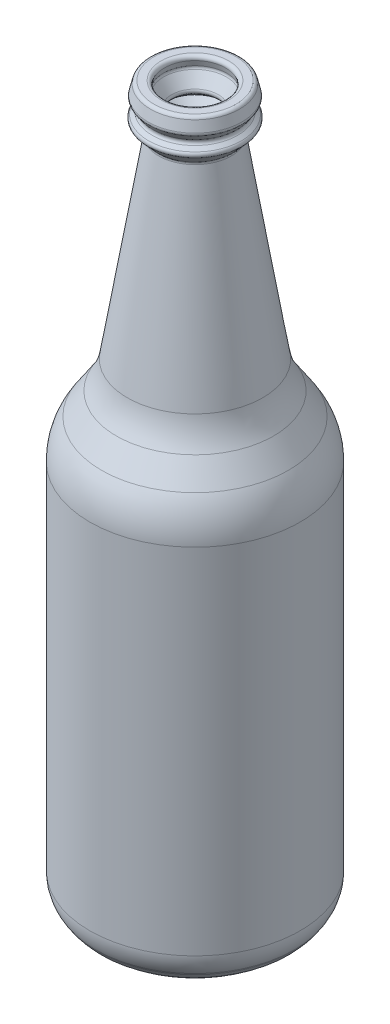
ISO-10303-21;
HEADER;
FILE_DESCRIPTION(('STEP AP214'),'2;1');
FILE_NAME('part.step','',(''),(''),'','','');
FILE_SCHEMA(('AUTOMOTIVE_DESIGN { 1 0 10303 214 1 1 1 1 }'));
ENDSEC;
DATA;
#1=APPLICATION_CONTEXT('core data for automotive mechanical design processes');
#2=APPLICATION_PROTOCOL_DEFINITION('international standard','automotive_design',2000,#1);
#3=PRODUCT_CONTEXT('',#1,'mechanical');
#4=PRODUCT('Part','Part','',(#3));
#5=PRODUCT_RELATED_PRODUCT_CATEGORY('part','',(#4));
#6=PRODUCT_DEFINITION_FORMATION('','',#4);
#7=PRODUCT_DEFINITION_CONTEXT('part definition',#1,'design');
#8=PRODUCT_DEFINITION('design','',#6,#7);
#9=PRODUCT_DEFINITION_SHAPE('','',#8);
#10=(LENGTH_UNIT() NAMED_UNIT(*) SI_UNIT(.MILLI.,.METRE.));
#11=(NAMED_UNIT(*) PLANE_ANGLE_UNIT() SI_UNIT($,.RADIAN.));
#12=(NAMED_UNIT(*) SI_UNIT($,.STERADIAN.) SOLID_ANGLE_UNIT());
#13=UNCERTAINTY_MEASURE_WITH_UNIT(LENGTH_MEASURE(1.E-05),#10,'distance_accuracy_value','');
#14=(GEOMETRIC_REPRESENTATION_CONTEXT(3) GLOBAL_UNCERTAINTY_ASSIGNED_CONTEXT((#13)) GLOBAL_UNIT_ASSIGNED_CONTEXT((#10,
#11,#12)) REPRESENTATION_CONTEXT('',''));
#15=CARTESIAN_POINT('',(0.,0.,0.));
#16=DIRECTION('',(0.,0.,1.));
#17=DIRECTION('',(1.,0.,0.));
#18=AXIS2_PLACEMENT_3D('',#15,#16,#17);
#19=CARTESIAN_POINT('',(0.,47.7867381624694,0.));
#20=DIRECTION('',(0.,-1.,0.));
#21=DIRECTION('',(0.,0.,-1.));
#22=AXIS2_PLACEMENT_3D('',#19,#20,#21);
#23=PLANE('',#22);
#24=CARTESIAN_POINT('',(0.,47.7867381624694,0.));
#25=DIRECTION('',(0.,-1.,0.));
#26=DIRECTION('',(0.,0.,-1.));
#27=AXIS2_PLACEMENT_3D('',#24,#25,#26);
#28=CIRCLE('',#27,9.65767078078676);
#29=CARTESIAN_POINT('',(0.,47.7867381624694,-9.65767078078676));
#30=VERTEX_POINT('',#29);
#31=EDGE_CURVE('E74',#30,#30,#28,.T.);
#32=ORIENTED_EDGE('',*,*,#31,.T.);
#33=EDGE_LOOP('',(#32));
#34=FACE_BOUND('',#33,.T.);
#35=CARTESIAN_POINT('',(0.,47.7867381624694,0.));
#36=DIRECTION('',(0.,-1.,0.));
#37=DIRECTION('',(0.,0.,-1.));
#38=AXIS2_PLACEMENT_3D('',#35,#36,#37);
#39=CIRCLE('',#38,11.7192235935956);
#40=CARTESIAN_POINT('',(0.,47.7867381624694,-11.7192235935956));
#41=VERTEX_POINT('',#40);
#42=EDGE_CURVE('E77',#41,#41,#39,.F.);
#43=ORIENTED_EDGE('',*,*,#42,.T.);
#44=EDGE_LOOP('',(#43));
#45=FACE_BOUND('',#44,.T.);
#46=ADVANCED_FACE('F39',(#34,#45),#23,.F.);
#47=CARTESIAN_POINT('',(0.,43.7867381624694,0.));
#48=DIRECTION('',(0.,-1.,0.));
#49=DIRECTION('',(0.,0.,-1.));
#50=AXIS2_PLACEMENT_3D('',#47,#48,#49);
#51=CONICAL_SURFACE('',#50,13.5,0.244978663126864);
#52=CARTESIAN_POINT('',(0.,47.0292737875058,0.));
#53=DIRECTION('',(0.,1.,0.));
#54=DIRECTION('',(0.,0.,1.));
#55=AXIS2_PLACEMENT_3D('',#52,#53,#54);
#56=CIRCLE('',#55,12.6893660937409);
#57=CARTESIAN_POINT('',(0.,47.0292737875058,12.6893660937409));
#58=VERTEX_POINT('',#57);
#59=EDGE_CURVE('E68',#58,#58,#56,.F.);
#60=ORIENTED_EDGE('',*,*,#59,.T.);
#61=EDGE_LOOP('',(#60));
#62=FACE_BOUND('',#61,.T.);
#63=CARTESIAN_POINT('',(0.,44.226846084556,0.));
#64=DIRECTION('',(0.,1.,0.));
#65=DIRECTION('',(0.,0.,1.));
#66=AXIS2_PLACEMENT_3D('',#63,#64,#65);
#67=CIRCLE('',#66,13.3899730194784);
#68=CARTESIAN_POINT('',(0.,44.226846084556,13.3899730194784));
#69=VERTEX_POINT('',#68);
#70=EDGE_CURVE('E71',#69,#69,#67,.T.);
#71=ORIENTED_EDGE('',*,*,#70,.T.);
#72=EDGE_LOOP('',(#71));
#73=FACE_BOUND('',#72,.T.);
#74=ADVANCED_FACE('F159',(#62,#73),#51,.T.);
#75=CARTESIAN_POINT('',(0.,40.905561630467,0.));
#76=DIRECTION('',(0.,1.,0.));
#77=DIRECTION('',(0.,0.,1.));
#78=AXIS2_PLACEMENT_3D('',#75,#76,#77);
#79=CONICAL_SURFACE('',#78,11.5,0.606796323628334);
#80=CARTESIAN_POINT('',(0.,43.4140718217374,0.));
#81=DIRECTION('',(0.,-1.,0.));
#82=DIRECTION('',(0.,0.,-1.));
#83=AXIS2_PLACEMENT_3D('',#80,#81,#82);
#84=CIRCLE('',#83,13.2413096097427);
#85=CARTESIAN_POINT('',(0.,43.4140718217374,-13.2413096097427));
#86=VERTEX_POINT('',#85);
#87=EDGE_CURVE('E62',#86,#86,#84,.T.);
#88=ORIENTED_EDGE('',*,*,#87,.T.);
#89=EDGE_LOOP('',(#88));
#90=FACE_BOUND('',#89,.T.);
#91=CARTESIAN_POINT('',(0.,41.6515394006293,0.));
#92=DIRECTION('',(0.,1.,0.));
#93=DIRECTION('',(0.,0.,1.));
#94=AXIS2_PLACEMENT_3D('',#91,#92,#93);
#95=CIRCLE('',#94,12.0178285758449);
#96=CARTESIAN_POINT('',(0.,41.6515394006293,12.0178285758449));
#97=VERTEX_POINT('',#96);
#98=EDGE_CURVE('E65',#97,#97,#95,.T.);
#99=ORIENTED_EDGE('',*,*,#98,.T.);
#100=EDGE_LOOP('',(#99));
#101=FACE_BOUND('',#100,.T.);
#102=ADVANCED_FACE('F166',(#90,#101),#79,.T.);
#103=CARTESIAN_POINT('',(0.,38.7867381624694,0.));
#104=DIRECTION('',(0.,-1.,0.));
#105=DIRECTION('',(0.,0.,-1.));
#106=AXIS2_PLACEMENT_3D('',#103,#104,#105);
#107=CONICAL_SURFACE('',#106,14.,0.867738330404684);
#108=CARTESIAN_POINT('',(0.,40.3184321640019,0.));
#109=DIRECTION('',(0.,-1.,0.));
#110=DIRECTION('',(0.,0.,-1.));
#111=AXIS2_PLACEMENT_3D('',#108,#109,#110);
#112=CIRCLE('',#111,12.1927541101619);
#113=CARTESIAN_POINT('',(0.,40.3184321640019,-12.1927541101619));
#114=VERTEX_POINT('',#113);
#115=EDGE_CURVE('E54',#114,#114,#112,.T.);
#116=ORIENTED_EDGE('',*,*,#115,.T.);
#117=EDGE_LOOP('',(#116));
#118=FACE_BOUND('',#117,.T.);
#119=CARTESIAN_POINT('',(0.,39.4635425818309,0.));
#120=DIRECTION('',(0.,1.,0.));
#121=DIRECTION('',(0.,0.,1.));
#122=AXIS2_PLACEMENT_3D('',#119,#120,#121);
#123=CIRCLE('',#122,13.2014384048698);
#124=CARTESIAN_POINT('',(0.,39.4635425818309,13.2014384048698));
#125=VERTEX_POINT('',#124);
#126=EDGE_CURVE('E59',#125,#125,#123,.T.);
#127=ORIENTED_EDGE('',*,*,#126,.T.);
#128=EDGE_LOOP('',(#127));
#129=FACE_BOUND('',#128,.T.);
#130=ADVANCED_FACE('F225',(#118,#129),#107,.T.);
#131=CARTESIAN_POINT('',(0.,34.7867381624694,0.));
#132=DIRECTION('',(0.,1.,0.));
#133=DIRECTION('',(0.,0.,1.));
#134=AXIS2_PLACEMENT_3D('',#131,#132,#133);
#135=CONICAL_SURFACE('',#134,10.2828057039004,0.748768373128357);
#136=CARTESIAN_POINT('',(0.,38.0199369073976,0.));
#137=DIRECTION('',(0.,-1.,0.));
#138=DIRECTION('',(0.,0.,-1.));
#139=AXIS2_PLACEMENT_3D('',#136,#137,#138);
#140=CIRCLE('',#139,13.2874126871012);
#141=CARTESIAN_POINT('',(0.,38.0199369073976,-13.2874126871012));
#142=VERTEX_POINT('',#141);
#143=EDGE_CURVE('E46',#142,#142,#140,.T.);
#144=ORIENTED_EDGE('',*,*,#143,.T.);
#145=EDGE_LOOP('',(#144));
#146=FACE_BOUND('',#145,.T.);
#147=CARTESIAN_POINT('',(0.,35.1448125063518,0.));
#148=DIRECTION('',(0.,1.,0.));
#149=DIRECTION('',(0.,0.,1.));
#150=AXIS2_PLACEMENT_3D('',#147,#148,#149);
#151=CIRCLE('',#150,10.6155636810652);
#152=CARTESIAN_POINT('',(0.,35.1448125063518,10.6155636810652));
#153=VERTEX_POINT('',#152);
#154=EDGE_CURVE('E50',#153,#153,#151,.T.);
#155=ORIENTED_EDGE('',*,*,#154,.T.);
#156=EDGE_LOOP('',(#155));
#157=FACE_BOUND('',#156,.T.);
#158=ADVANCED_FACE('F227',(#146,#157),#135,.T.);
#159=CARTESIAN_POINT('',(0.,-25.2132618375306,0.));
#160=DIRECTION('',(0.,-1.,0.));
#161=DIRECTION('',(0.,0.,-1.));
#162=AXIS2_PLACEMENT_3D('',#159,#160,#161);
#163=CONICAL_SURFACE('',#162,20.,0.160559163224514);
#164=CARTESIAN_POINT('',(0.,34.3042052278936,0.));
#165=DIRECTION('',(0.,-1.,0.));
#166=DIRECTION('',(0.,0.,-1.));
#167=AXIS2_PLACEMENT_3D('',#164,#165,#166);
#168=CIRCLE('',#167,10.3609534752261);
#169=CARTESIAN_POINT('',(0.,34.3042052278936,-10.3609534752261));
#170=VERTEX_POINT('',#169);
#171=EDGE_CURVE('E10',#170,#170,#168,.T.);
#172=ORIENTED_EDGE('',*,*,#171,.T.);
#173=EDGE_LOOP('',(#172));
#174=FACE_BOUND('',#173,.T.);
#175=CARTESIAN_POINT('',(0.,-20.9283651155265,0.));
#176=DIRECTION('',(0.,-1.,0.));
#177=DIRECTION('',(0.,0.,-1.));
#178=AXIS2_PLACEMENT_3D('',#175,#176,#177);
#179=CIRCLE('',#178,19.3060471002261);
#180=CARTESIAN_POINT('',(0.,-20.9283651155265,-19.3060471002261));
#181=VERTEX_POINT('',#180);
#182=EDGE_CURVE('E122',#181,#181,#179,.F.);
#183=ORIENTED_EDGE('',*,*,#182,.T.);
#184=EDGE_LOOP('',(#183));
#185=FACE_BOUND('',#184,.T.);
#186=ADVANCED_FACE('F234',(#174,#185),#163,.T.);
#187=CARTESIAN_POINT('',(0.,-40.2132618375306,0.));
#188=DIRECTION('',(0.,-1.,0.));
#189=DIRECTION('',(0.,0.,-1.));
#190=AXIS2_PLACEMENT_3D('',#187,#188,#189);
#191=CONICAL_SURFACE('',#190,30.,0.588002603547568);
#192=CARTESIAN_POINT('',(0.,-28.8249649826293,0.));
#193=DIRECTION('',(0.,-1.,0.));
#194=DIRECTION('',(0.,0.,-1.));
#195=AXIS2_PLACEMENT_3D('',#192,#193,#194);
#196=CIRCLE('',#195,22.4078020967325);
#197=CARTESIAN_POINT('',(0.,-28.8249649826293,-22.4078020967325));
#198=VERTEX_POINT('',#197);
#199=EDGE_CURVE('E116',#198,#198,#196,.T.);
#200=ORIENTED_EDGE('',*,*,#199,.T.);
#201=EDGE_LOOP('',(#200));
#202=FACE_BOUND('',#201,.T.);
#203=CARTESIAN_POINT('',(0.,-35.1747706676659,0.));
#204=DIRECTION('',(0.,1.,0.));
#205=DIRECTION('',(0.,0.,1.));
#206=AXIS2_PLACEMENT_3D('',#203,#204,#205);
#207=CIRCLE('',#206,26.6410058867569);
#208=CARTESIAN_POINT('',(0.,-35.1747706676659,26.6410058867569));
#209=VERTEX_POINT('',#208);
#210=EDGE_CURVE('E119',#209,#209,#207,.T.);
#211=ORIENTED_EDGE('',*,*,#210,.T.);
#212=EDGE_LOOP('',(#211));
#213=FACE_BOUND('',#212,.T.);
#214=ADVANCED_FACE('F240',(#202,#213),#191,.T.);
#215=CARTESIAN_POINT('',(0.,47.7867381624694,0.));
#216=DIRECTION('',(0.,1.,0.));
#217=DIRECTION('',(0.,0.,1.));
#218=AXIS2_PLACEMENT_3D('',#215,#216,#217);
#219=CYLINDRICAL_SURFACE('',#218,30.);
#220=CARTESIAN_POINT('',(0.,-147.185505460211,0.));
#221=DIRECTION('',(0.,-1.,0.));
#222=DIRECTION('',(0.,0.,-1.));
#223=AXIS2_PLACEMENT_3D('',#220,#221,#222);
#224=CIRCLE('',#223,30.);
#225=CARTESIAN_POINT('',(0.,-147.185505460211,-30.));
#226=VERTEX_POINT('',#225);
#227=EDGE_CURVE('E110',#226,#226,#224,.F.);
#228=ORIENTED_EDGE('',*,*,#227,.T.);
#229=EDGE_LOOP('',(#228));
#230=FACE_BOUND('',#229,.T.);
#231=CARTESIAN_POINT('',(0.,-46.2687745921705,0.));
#232=DIRECTION('',(0.,-1.,0.));
#233=DIRECTION('',(0.,0.,-1.));
#234=AXIS2_PLACEMENT_3D('',#231,#232,#233);
#235=CIRCLE('',#234,30.);
#236=CARTESIAN_POINT('',(0.,-46.2687745921705,-30.));
#237=VERTEX_POINT('',#236);
#238=EDGE_CURVE('E113',#237,#237,#235,.T.);
#239=ORIENTED_EDGE('',*,*,#238,.T.);
#240=EDGE_LOOP('',(#239));
#241=FACE_BOUND('',#240,.T.);
#242=ADVANCED_FACE('F243',(#230,#241),#219,.T.);
#243=CARTESIAN_POINT('',(0.,-157.713261837531,0.));
#244=DIRECTION('',(0.,1.,0.));
#245=DIRECTION('',(0.,0.,1.));
#246=AXIS2_PLACEMENT_3D('',#243,#244,#245);
#247=CONICAL_SURFACE('',#246,25.,0.588002603547572);
#248=CARTESIAN_POINT('',(0.,-152.732507422463,0.));
#249=DIRECTION('',(0.,-1.,0.));
#250=DIRECTION('',(0.,0.,-1.));
#251=AXIS2_PLACEMENT_3D('',#248,#249,#250);
#252=CIRCLE('',#251,28.3205029433784);
#253=CARTESIAN_POINT('',(0.,-152.732507422463,-28.3205029433784));
#254=VERTEX_POINT('',#253);
#255=EDGE_CURVE('E104',#254,#254,#252,.T.);
#256=ORIENTED_EDGE('',*,*,#255,.T.);
#257=EDGE_LOOP('',(#256));
#258=FACE_BOUND('',#257,.T.);
#259=CARTESIAN_POINT('',(0.,-153.260263799783,0.));
#260=DIRECTION('',(0.,-1.,0.));
#261=DIRECTION('',(0.,0.,-1.));
#262=AXIS2_PLACEMENT_3D('',#259,#260,#261);
#263=CIRCLE('',#262,27.9686653584985);
#264=CARTESIAN_POINT('',(0.,-153.260263799783,-27.9686653584985));
#265=VERTEX_POINT('',#264);
#266=EDGE_CURVE('E107',#265,#265,#263,.F.);
#267=ORIENTED_EDGE('',*,*,#266,.T.);
#268=EDGE_LOOP('',(#267));
#269=FACE_BOUND('',#268,.T.);
#270=ADVANCED_FACE('F247',(#258,#269),#247,.T.);
#271=CARTESIAN_POINT('',(25.,-157.713261837531,0.));
#272=DIRECTION('',(0.,1.,0.));
#273=DIRECTION('',(0.,0.,1.));
#274=AXIS2_PLACEMENT_3D('',#271,#272,#273);
#275=PLANE('',#274);
#276=CARTESIAN_POINT('',(0.,-157.713261837531,0.));
#277=DIRECTION('',(0.,1.,0.));
#278=DIRECTION('',(0.,0.,1.));
#279=AXIS2_PLACEMENT_3D('',#276,#277,#278);
#280=CIRCLE('',#279,19.6481624151201);
#281=CARTESIAN_POINT('',(0.,-157.713261837531,19.6481624151201));
#282=VERTEX_POINT('',#281);
#283=EDGE_CURVE('E101',#282,#282,#280,.F.);
#284=ORIENTED_EDGE('',*,*,#283,.T.);
#285=EDGE_LOOP('',(#284));
#286=FACE_BOUND('',#285,.T.);
#287=ADVANCED_FACE('F251',(#286),#275,.F.);
#288=CARTESIAN_POINT('',(0.,42.8165956623241,0.));
#289=DIRECTION('',(0.,-1.,0.));
#290=DIRECTION('',(0.,0.,-1.));
#291=AXIS2_PLACEMENT_3D('',#288,#289,#290);
#292=CONICAL_SURFACE('',#291,9.61942999941867,0.244978663126864);
#293=CARTESIAN_POINT('',(0.,45.017135272757,0.));
#294=DIRECTION('',(0.,-1.,0.));
#295=DIRECTION('',(0.,0.,-1.));
#296=AXIS2_PLACEMENT_3D('',#293,#294,#295);
#297=CIRCLE('',#296,9.06929509681045);
#298=CARTESIAN_POINT('',(0.,45.017135272757,-9.06929509681045));
#299=VERTEX_POINT('',#298);
#300=EDGE_CURVE('E80',#299,#299,#297,.T.);
#301=ORIENTED_EDGE('',*,*,#300,.T.);
#302=EDGE_LOOP('',(#301));
#303=FACE_BOUND('',#302,.T.);
#304=CARTESIAN_POINT('',(0.,46.5442025374331,0.));
#305=DIRECTION('',(0.,-1.,0.));
#306=DIRECTION('',(0.,0.,-1.));
#307=AXIS2_PLACEMENT_3D('',#304,#305,#306);
#308=CIRCLE('',#307,8.68752828064143);
#309=CARTESIAN_POINT('',(0.,46.5442025374331,-8.68752828064143));
#310=VERTEX_POINT('',#309);
#311=EDGE_CURVE('E83',#310,#310,#308,.F.);
#312=ORIENTED_EDGE('',*,*,#311,.T.);
#313=EDGE_LOOP('',(#312));
#314=FACE_BOUND('',#313,.T.);
#315=ADVANCED_FACE('F155',(#303,#314),#292,.F.);
#316=CARTESIAN_POINT('',(0.,43.186516181596,0.));
#317=DIRECTION('',(0.,1.,0.));
#318=DIRECTION('',(0.,0.,1.));
#319=AXIS2_PLACEMENT_3D('',#316,#317,#318);
#320=CONICAL_SURFACE('',#319,8.21408363836146,0.606796323628334);
#321=CARTESIAN_POINT('',(0.,40.9485828711091,0.));
#322=DIRECTION('',(0.,-1.,0.));
#323=DIRECTION('',(0.,0.,-1.));
#324=AXIS2_PLACEMENT_3D('',#321,#322,#323);
#325=CIRCLE('',#324,6.66059791082676);
#326=CARTESIAN_POINT('',(0.,40.9485828711091,-6.66059791082676));
#327=VERTEX_POINT('',#326);
#328=EDGE_CURVE('E86',#327,#327,#325,.T.);
#329=ORIENTED_EDGE('',*,*,#328,.T.);
#330=EDGE_LOOP('',(#329));
#331=FACE_BOUND('',#330,.T.);
#332=CARTESIAN_POINT('',(0.,44.2043610099384,0.));
#333=DIRECTION('',(0.,1.,0.));
#334=DIRECTION('',(0.,0.,1.));
#335=AXIS2_PLACEMENT_3D('',#332,#333,#334);
#336=CIRCLE('',#335,8.92063168707475);
#337=CARTESIAN_POINT('',(0.,44.2043610099384,8.92063168707475));
#338=VERTEX_POINT('',#337);
#339=EDGE_CURVE('E89',#338,#338,#336,.T.);
#340=ORIENTED_EDGE('',*,*,#339,.T.);
#341=EDGE_LOOP('',(#340));
#342=FACE_BOUND('',#341,.T.);
#343=ADVANCED_FACE('F145',(#331,#342),#320,.F.);
#344=CARTESIAN_POINT('',(0.,35.7352637670888,0.));
#345=DIRECTION('',(0.,-1.,0.));
#346=DIRECTION('',(0.,0.,-1.));
#347=AXIS2_PLACEMENT_3D('',#344,#345,#346);
#348=CONICAL_SURFACE('',#347,11.4137857756295,0.867738330404684);
#349=CARTESIAN_POINT('',(0.,39.6154756344817,0.));
#350=DIRECTION('',(0.,1.,0.));
#351=DIRECTION('',(0.,0.,1.));
#352=AXIS2_PLACEMENT_3D('',#349,#350,#351);
#353=CIRCLE('',#352,6.83552344514378);
#354=CARTESIAN_POINT('',(0.,39.6154756344817,6.83552344514378));
#355=VERTEX_POINT('',#354);
#356=EDGE_CURVE('E92',#355,#355,#353,.T.);
#357=ORIENTED_EDGE('',*,*,#356,.T.);
#358=EDGE_LOOP('',(#357));
#359=FACE_BOUND('',#358,.T.);
#360=CARTESIAN_POINT('',(0.,38.4424814445344,0.));
#361=DIRECTION('',(0.,1.,0.));
#362=DIRECTION('',(0.,0.,1.));
#363=AXIS2_PLACEMENT_3D('',#360,#361,#362);
#364=CIRCLE('',#363,8.21953939510855);
#365=CARTESIAN_POINT('',(0.,38.4424814445344,8.21953939510855));
#366=VERTEX_POINT('',#365);
#367=EDGE_CURVE('E125',#366,#366,#364,.T.);
#368=ORIENTED_EDGE('',*,*,#367,.F.);
#369=EDGE_LOOP('',(#368));
#370=FACE_BOUND('',#369,.T.);
#371=ADVANCED_FACE('F143',(#359,#370),#348,.F.);
#372=CARTESIAN_POINT('',(0.,37.5096864648219,0.));
#373=DIRECTION('',(0.,1.,0.));
#374=DIRECTION('',(0.,0.,1.));
#375=AXIS2_PLACEMENT_3D('',#372,#373,#374);
#376=CONICAL_SURFACE('',#375,7.3526943506041,0.748768373128357);
#377=CARTESIAN_POINT('',(0.,36.4354634331748,0.));
#378=DIRECTION('',(0.,-1.,0.));
#379=DIRECTION('',(0.,0.,-1.));
#380=AXIS2_PLACEMENT_3D('',#377,#378,#379);
#381=CIRCLE('',#380,6.35442041910983);
#382=CARTESIAN_POINT('',(0.,36.4354634331748,-6.35442041910983));
#383=VERTEX_POINT('',#382);
#384=EDGE_CURVE('E95',#383,#383,#381,.T.);
#385=ORIENTED_EDGE('',*,*,#384,.T.);
#386=EDGE_LOOP('',(#385));
#387=FACE_BOUND('',#386,.T.);
#388=ORIENTED_EDGE('',*,*,#367,.T.);
#389=EDGE_LOOP('',(#388));
#390=FACE_BOUND('',#389,.T.);
#391=ADVANCED_FACE('F141',(#387,#390),#376,.F.);
#392=CARTESIAN_POINT('',(0.,-25.8527426490109,0.));
#393=DIRECTION('',(0.,-1.,0.));
#394=DIRECTION('',(0.,0.,-1.));
#395=AXIS2_PLACEMENT_3D('',#392,#393,#394);
#396=CONICAL_SURFACE('',#395,16.0514478233473,0.160559163224514);
#397=CARTESIAN_POINT('',(0.,35.5948561547167,0.));
#398=DIRECTION('',(0.,1.,0.));
#399=DIRECTION('',(0.,0.,1.));
#400=AXIS2_PLACEMENT_3D('',#397,#398,#399);
#401=CIRCLE('',#400,6.09981021327074);
#402=CARTESIAN_POINT('',(0.,35.5948561547167,6.09981021327074));
#403=VERTEX_POINT('',#402);
#404=EDGE_CURVE('E98',#403,#403,#401,.T.);
#405=ORIENTED_EDGE('',*,*,#404,.T.);
#406=EDGE_LOOP('',(#405));
#407=FACE_BOUND('',#406,.T.);
#408=CARTESIAN_POINT('',(0.,-26.7097219934117,0.));
#409=DIRECTION('',(0.,1.,0.));
#410=DIRECTION('',(0.,0.,1.));
#411=AXIS2_PLACEMENT_3D('',#408,#409,#410);
#412=CIRCLE('',#411,16.1902384033021);
#413=CARTESIAN_POINT('',(0.,-26.7097219934117,16.1902384033021));
#414=VERTEX_POINT('',#413);
#415=EDGE_CURVE('E135',#414,#414,#412,.T.);
#416=ORIENTED_EDGE('',*,*,#415,.F.);
#417=EDGE_LOOP('',(#416));
#418=FACE_BOUND('',#417,.T.);
#419=ADVANCED_FACE('F152',(#407,#418),#396,.F.);
#420=CARTESIAN_POINT('',(0.,-42.4320626224315,0.));
#421=DIRECTION('',(0.,-1.,0.));
#422=DIRECTION('',(0.,0.,-1.));
#423=AXIS2_PLACEMENT_3D('',#420,#421,#422);
#424=CONICAL_SURFACE('',#423,26.6717988226486,0.588002603547568);
#425=ORIENTED_EDGE('',*,*,#415,.T.);
#426=EDGE_LOOP('',(#425));
#427=FACE_BOUND('',#426,.T.);
#428=CARTESIAN_POINT('',(0.,-41.4243643884585,0.));
#429=DIRECTION('',(0.,-1.,0.));
#430=DIRECTION('',(0.,0.,-1.));
#431=AXIS2_PLACEMENT_3D('',#428,#429,#430);
#432=CIRCLE('',#431,26.);
#433=CARTESIAN_POINT('',(0.,-41.4243643884585,-26.));
#434=VERTEX_POINT('',#433);
#435=EDGE_CURVE('E132',#434,#434,#432,.F.);
#436=ORIENTED_EDGE('',*,*,#435,.F.);
#437=EDGE_LOOP('',(#436));
#438=FACE_BOUND('',#437,.T.);
#439=ADVANCED_FACE('F266',(#427,#438),#424,.F.);
#440=CARTESIAN_POINT('',(0.,47.7867381624694,0.));
#441=DIRECTION('',(0.,1.,0.));
#442=DIRECTION('',(0.,0.,1.));
#443=AXIS2_PLACEMENT_3D('',#440,#441,#442);
#444=CYLINDRICAL_SURFACE('',#443,26.);
#445=ORIENTED_EDGE('',*,*,#435,.T.);
#446=EDGE_LOOP('',(#445));
#447=FACE_BOUND('',#446,.T.);
#448=CARTESIAN_POINT('',(0.,-149.002159286603,0.));
#449=DIRECTION('',(0.,1.,0.));
#450=DIRECTION('',(0.,0.,1.));
#451=AXIS2_PLACEMENT_3D('',#448,#449,#450);
#452=CIRCLE('',#451,26.);
#453=CARTESIAN_POINT('',(0.,-149.002159286603,26.));
#454=VERTEX_POINT('',#453);
#455=EDGE_CURVE('E129',#454,#454,#452,.T.);
#456=ORIENTED_EDGE('',*,*,#455,.F.);
#457=EDGE_LOOP('',(#456));
#458=FACE_BOUND('',#457,.T.);
#459=ADVANCED_FACE('F262',(#447,#458),#444,.F.);
#460=CARTESIAN_POINT('',(0.,-155.49446105263,0.));
#461=DIRECTION('',(0.,1.,0.));
#462=DIRECTION('',(0.,0.,1.));
#463=AXIS2_PLACEMENT_3D('',#460,#461,#462);
#464=CONICAL_SURFACE('',#463,21.6717988226486,0.588002603547572);
#465=ORIENTED_EDGE('',*,*,#455,.T.);
#466=EDGE_LOOP('',(#465));
#467=FACE_BOUND('',#466,.T.);
#468=CARTESIAN_POINT('',(0.,-153.713261837531,0.));
#469=DIRECTION('',(0.,1.,0.));
#470=DIRECTION('',(0.,0.,1.));
#471=AXIS2_PLACEMENT_3D('',#468,#469,#470);
#472=CIRCLE('',#471,22.859264966048);
#473=CARTESIAN_POINT('',(0.,-153.713261837531,22.859264966048));
#474=VERTEX_POINT('',#473);
#475=EDGE_CURVE('E126',#474,#474,#472,.T.);
#476=ORIENTED_EDGE('',*,*,#475,.F.);
#477=EDGE_LOOP('',(#476));
#478=FACE_BOUND('',#477,.T.);
#479=ADVANCED_FACE('F258',(#467,#478),#464,.F.);
#480=CARTESIAN_POINT('',(25.,-153.713261837531,0.));
#481=DIRECTION('',(0.,1.,0.));
#482=DIRECTION('',(0.,0.,1.));
#483=AXIS2_PLACEMENT_3D('',#480,#481,#482);
#484=PLANE('',#483);
#485=ORIENTED_EDGE('',*,*,#475,.T.);
#486=EDGE_LOOP('',(#485));
#487=FACE_BOUND('',#486,.T.);
#488=ADVANCED_FACE('F176',(#487),#484,.T.);
#489=CARTESIAN_POINT('',(0.,-17.7309610581247,0.));
#490=DIRECTION('',(0.,1.,0.));
#491=DIRECTION('',(0.,0.,1.));
#492=AXIS2_PLACEMENT_3D('',#489,#490,#491);
#493=TOROIDAL_SURFACE('',#492,39.0488079834894,20.);
#494=ORIENTED_EDGE('',*,*,#199,.F.);
#495=EDGE_LOOP('',(#494));
#496=FACE_BOUND('',#495,.T.);
#497=ORIENTED_EDGE('',*,*,#182,.F.);
#498=EDGE_LOOP('',(#497));
#499=FACE_BOUND('',#498,.T.);
#500=ADVANCED_FACE('F172',(#496,#499),#493,.F.);
#501=CARTESIAN_POINT('',(0.,-46.2687745921705,0.));
#502=DIRECTION('',(0.,-1.,0.));
#503=DIRECTION('',(0.,0.,-1.));
#504=AXIS2_PLACEMENT_3D('',#501,#502,#503);
#505=DEGENERATE_TOROIDAL_SURFACE('',#504,10.,20.,.T.);
#506=ORIENTED_EDGE('',*,*,#238,.F.);
#507=EDGE_LOOP('',(#506));
#508=FACE_BOUND('',#507,.T.);
#509=ORIENTED_EDGE('',*,*,#210,.F.);
#510=EDGE_LOOP('',(#509));
#511=FACE_BOUND('',#510,.T.);
#512=ADVANCED_FACE('F175',(#508,#511),#505,.T.);
#513=CARTESIAN_POINT('',(0.,-147.185505460211,0.));
#514=DIRECTION('',(0.,-1.,0.));
#515=DIRECTION('',(0.,0.,-1.));
#516=AXIS2_PLACEMENT_3D('',#513,#514,#515);
#517=TOROIDAL_SURFACE('',#516,20.,10.);
#518=ORIENTED_EDGE('',*,*,#255,.F.);
#519=EDGE_LOOP('',(#518));
#520=FACE_BOUND('',#519,.T.);
#521=ORIENTED_EDGE('',*,*,#227,.F.);
#522=EDGE_LOOP('',(#521));
#523=FACE_BOUND('',#522,.T.);
#524=ADVANCED_FACE('F180',(#520,#523),#517,.T.);
#525=CARTESIAN_POINT('',(0.,-147.713261837531,0.));
#526=DIRECTION('',(0.,1.,0.));
#527=DIRECTION('',(0.,0.,1.));
#528=AXIS2_PLACEMENT_3D('',#525,#526,#527);
#529=TOROIDAL_SURFACE('',#528,19.6481624151201,10.);
#530=ORIENTED_EDGE('',*,*,#283,.F.);
#531=EDGE_LOOP('',(#530));
#532=FACE_BOUND('',#531,.T.);
#533=ORIENTED_EDGE('',*,*,#266,.F.);
#534=EDGE_LOOP('',(#533));
#535=FACE_BOUND('',#534,.T.);
#536=ADVANCED_FACE('F184',(#532,#535),#529,.T.);
#537=CARTESIAN_POINT('',(0.,35.7547263575867,0.));
#538=DIRECTION('',(0.,-1.,0.));
#539=DIRECTION('',(0.,0.,-1.));
#540=AXIS2_PLACEMENT_3D('',#537,#538,#539);
#541=TOROIDAL_SURFACE('',#540,7.08694825743391,1.);
#542=ORIENTED_EDGE('',*,*,#384,.F.);
#543=EDGE_LOOP('',(#542));
#544=FACE_BOUND('',#543,.T.);
#545=ORIENTED_EDGE('',*,*,#404,.F.);
#546=EDGE_LOOP('',(#545));
#547=FACE_BOUND('',#546,.T.);
#548=ADVANCED_FACE('F187',(#544,#547),#541,.T.);
#549=CARTESIAN_POINT('',(0.,40.3783442333269,0.));
#550=DIRECTION('',(0.,-1.,0.));
#551=DIRECTION('',(0.,0.,-1.));
#552=AXIS2_PLACEMENT_3D('',#549,#550,#551);
#553=TOROIDAL_SURFACE('',#552,7.48207700123639,1.);
#554=ORIENTED_EDGE('',*,*,#328,.F.);
#555=EDGE_LOOP('',(#554));
#556=FACE_BOUND('',#555,.T.);
#557=ORIENTED_EDGE('',*,*,#356,.F.);
#558=EDGE_LOOP('',(#557));
#559=FACE_BOUND('',#558,.T.);
#560=ADVANCED_FACE('F191',(#556,#559),#553,.T.);
#561=CARTESIAN_POINT('',(0.,44.7745996477207,0.));
#562=DIRECTION('',(0.,1.,0.));
#563=DIRECTION('',(0.,0.,1.));
#564=AXIS2_PLACEMENT_3D('',#561,#562,#563);
#565=TOROIDAL_SURFACE('',#564,8.09915259666512,1.);
#566=ORIENTED_EDGE('',*,*,#300,.F.);
#567=EDGE_LOOP('',(#566));
#568=FACE_BOUND('',#567,.T.);
#569=ORIENTED_EDGE('',*,*,#339,.F.);
#570=EDGE_LOOP('',(#569));
#571=FACE_BOUND('',#570,.T.);
#572=ADVANCED_FACE('F195',(#568,#571),#565,.F.);
#573=CARTESIAN_POINT('',(0.,46.7867381624694,0.));
#574=DIRECTION('',(0.,-1.,0.));
#575=DIRECTION('',(0.,0.,-1.));
#576=AXIS2_PLACEMENT_3D('',#573,#574,#575);
#577=TOROIDAL_SURFACE('',#576,9.65767078078676,1.);
#578=ORIENTED_EDGE('',*,*,#31,.F.);
#579=EDGE_LOOP('',(#578));
#580=FACE_BOUND('',#579,.T.);
#581=ORIENTED_EDGE('',*,*,#311,.F.);
#582=EDGE_LOOP('',(#581));
#583=FACE_BOUND('',#582,.T.);
#584=ADVANCED_FACE('F199',(#580,#583),#577,.T.);
#585=CARTESIAN_POINT('',(0.,46.7867381624694,0.));
#586=DIRECTION('',(0.,-1.,0.));
#587=DIRECTION('',(0.,0.,-1.));
#588=AXIS2_PLACEMENT_3D('',#585,#586,#587);
#589=TOROIDAL_SURFACE('',#588,11.7192235935956,1.);
#590=ORIENTED_EDGE('',*,*,#59,.F.);
#591=EDGE_LOOP('',(#590));
#592=FACE_BOUND('',#591,.T.);
#593=ORIENTED_EDGE('',*,*,#42,.F.);
#594=EDGE_LOOP('',(#593));
#595=FACE_BOUND('',#594,.T.);
#596=ADVANCED_FACE('F203',(#592,#595),#589,.T.);
#597=CARTESIAN_POINT('',(0.,43.9843104595197,0.));
#598=DIRECTION('',(0.,-1.,0.));
#599=DIRECTION('',(0.,0.,-1.));
#600=AXIS2_PLACEMENT_3D('',#597,#598,#599);
#601=TOROIDAL_SURFACE('',#600,12.419830519333,1.);
#602=ORIENTED_EDGE('',*,*,#87,.F.);
#603=EDGE_LOOP('',(#602));
#604=FACE_BOUND('',#603,.T.);
#605=ORIENTED_EDGE('',*,*,#70,.F.);
#606=EDGE_LOOP('',(#605));
#607=FACE_BOUND('',#606,.T.);
#608=ADVANCED_FACE('F207',(#604,#607),#601,.T.);
#609=CARTESIAN_POINT('',(0.,41.081300762847,0.));
#610=DIRECTION('',(0.,1.,0.));
#611=DIRECTION('',(0.,0.,1.));
#612=AXIS2_PLACEMENT_3D('',#609,#610,#611);
#613=TOROIDAL_SURFACE('',#612,12.8393076662545,1.);
#614=ORIENTED_EDGE('',*,*,#115,.F.);
#615=EDGE_LOOP('',(#614));
#616=FACE_BOUND('',#615,.T.);
#617=ORIENTED_EDGE('',*,*,#98,.F.);
#618=EDGE_LOOP('',(#617));
#619=FACE_BOUND('',#618,.T.);
#620=ADVANCED_FACE('F211',(#616,#619),#613,.F.);
#621=CARTESIAN_POINT('',(0.,38.7006739829857,0.));
#622=DIRECTION('',(0.,-1.,0.));
#623=DIRECTION('',(0.,0.,-1.));
#624=AXIS2_PLACEMENT_3D('',#621,#622,#623);
#625=TOROIDAL_SURFACE('',#624,12.5548848487771,1.);
#626=ORIENTED_EDGE('',*,*,#143,.F.);
#627=EDGE_LOOP('',(#626));
#628=FACE_BOUND('',#627,.T.);
#629=ORIENTED_EDGE('',*,*,#126,.F.);
#630=EDGE_LOOP('',(#629));
#631=FACE_BOUND('',#630,.T.);
#632=ADVANCED_FACE('F214',(#628,#631),#625,.T.);
#633=CARTESIAN_POINT('',(0.,34.4640754307637,0.));
#634=DIRECTION('',(0.,1.,0.));
#635=DIRECTION('',(0.,0.,1.));
#636=AXIS2_PLACEMENT_3D('',#633,#634,#635);
#637=TOROIDAL_SURFACE('',#636,11.3480915193893,1.);
#638=ORIENTED_EDGE('',*,*,#171,.F.);
#639=EDGE_LOOP('',(#638));
#640=FACE_BOUND('',#639,.T.);
#641=ORIENTED_EDGE('',*,*,#154,.F.);
#642=EDGE_LOOP('',(#641));
#643=FACE_BOUND('',#642,.T.);
#644=ADVANCED_FACE('F41',(#640,#643),#637,.F.);
#645=CLOSED_SHELL('',(#46,#74,#102,#130,#158,#186,#214,#242,#270,#287,#315,#343,#371,#391,#419,
#439,#459,#479,#488,#500,#512,#524,#536,#548,#560,#572,#584,#596,#608,#620,#632,#644));
#646=MANIFOLD_SOLID_BREP('B2',#645);
#647=ADVANCED_BREP_SHAPE_REPRESENTATION('',(#18,#646),#14);
#648=SHAPE_DEFINITION_REPRESENTATION(#9,#647);
ENDSEC;
END-ISO-10303-21;
